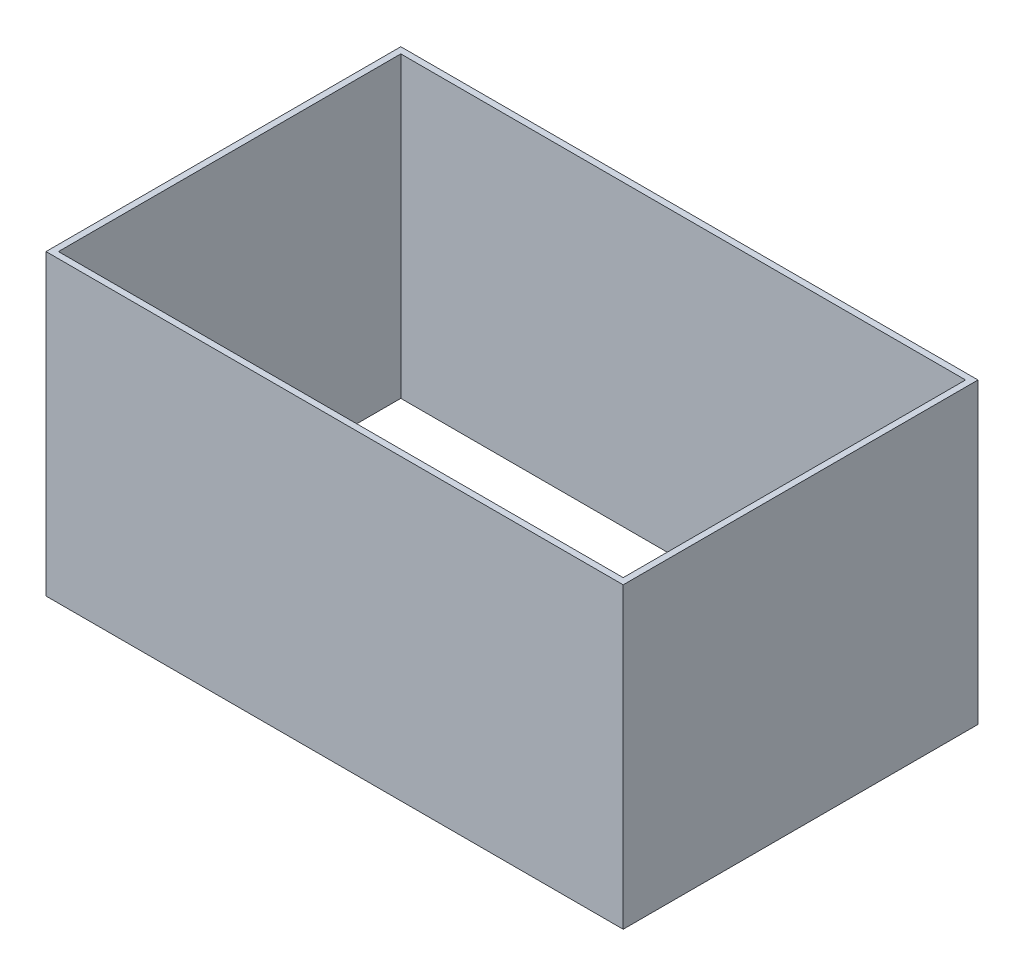
ISO-10303-21;
HEADER;
FILE_DESCRIPTION(('STEP AP214'),'2;1');
FILE_NAME('part.step','',(''),(''),'','','');
FILE_SCHEMA(('AUTOMOTIVE_DESIGN { 1 0 10303 214 1 1 1 1 }'));
ENDSEC;
DATA;
#1=APPLICATION_CONTEXT('core data for automotive mechanical design processes');
#2=APPLICATION_PROTOCOL_DEFINITION('international standard','automotive_design',2000,#1);
#3=PRODUCT_CONTEXT('',#1,'mechanical');
#4=PRODUCT('Part','Part','',(#3));
#5=PRODUCT_RELATED_PRODUCT_CATEGORY('part','',(#4));
#6=PRODUCT_DEFINITION_FORMATION('','',#4);
#7=PRODUCT_DEFINITION_CONTEXT('part definition',#1,'design');
#8=PRODUCT_DEFINITION('design','',#6,#7);
#9=PRODUCT_DEFINITION_SHAPE('','',#8);
#10=(LENGTH_UNIT() NAMED_UNIT(*) SI_UNIT(.MILLI.,.METRE.));
#11=(NAMED_UNIT(*) PLANE_ANGLE_UNIT() SI_UNIT($,.RADIAN.));
#12=(NAMED_UNIT(*) SI_UNIT($,.STERADIAN.) SOLID_ANGLE_UNIT());
#13=UNCERTAINTY_MEASURE_WITH_UNIT(LENGTH_MEASURE(1.E-05),#10,'distance_accuracy_value','');
#14=(GEOMETRIC_REPRESENTATION_CONTEXT(3) GLOBAL_UNCERTAINTY_ASSIGNED_CONTEXT((#13)) GLOBAL_UNIT_ASSIGNED_CONTEXT((#10,
#11,#12)) REPRESENTATION_CONTEXT('',''));
#15=CARTESIAN_POINT('',(0.,0.,0.));
#16=DIRECTION('',(0.,0.,1.));
#17=DIRECTION('',(1.,0.,0.));
#18=AXIS2_PLACEMENT_3D('',#15,#16,#17);
#19=CARTESIAN_POINT('',(0.,121.92,0.));
#20=DIRECTION('',(0.,1.,0.));
#21=DIRECTION('',(0.,0.,1.));
#22=AXIS2_PLACEMENT_3D('',#19,#20,#21);
#23=PLANE('',#22);
#24=DIRECTION('',(0.,0.,1.));
#25=VECTOR('',#24,1.);
#26=CARTESIAN_POINT('',(-117.943051820049,121.92,69.9586202337691));
#27=LINE('',#26,#25);
#28=CARTESIAN_POINT('',(-117.943051820049,121.92,-72.4986202337691));
#29=VERTEX_POINT('',#28);
#30=CARTESIAN_POINT('',(-117.943051820049,121.92,72.4986202337691));
#31=VERTEX_POINT('',#30);
#32=EDGE_CURVE('E183',#29,#31,#27,.T.);
#33=ORIENTED_EDGE('',*,*,#32,.T.);
#34=DIRECTION('',(1.,0.,0.));
#35=VECTOR('',#34,1.);
#36=CARTESIAN_POINT('',(115.403051820049,121.92,72.4986202337691));
#37=LINE('',#36,#35);
#38=CARTESIAN_POINT('',(117.943051820049,121.92,72.4986202337691));
#39=VERTEX_POINT('',#38);
#40=EDGE_CURVE('E187',#31,#39,#37,.T.);
#41=ORIENTED_EDGE('',*,*,#40,.T.);
#42=DIRECTION('',(0.,0.,-1.));
#43=VECTOR('',#42,1.);
#44=CARTESIAN_POINT('',(117.943051820049,121.92,69.9586202337691));
#45=LINE('',#44,#43);
#46=CARTESIAN_POINT('',(117.943051820049,121.92,-72.4986202337691));
#47=VERTEX_POINT('',#46);
#48=EDGE_CURVE('E191',#39,#47,#45,.T.);
#49=ORIENTED_EDGE('',*,*,#48,.T.);
#50=DIRECTION('',(-1.,0.,0.));
#51=VECTOR('',#50,1.);
#52=CARTESIAN_POINT('',(115.403051820049,121.92,-72.4986202337691));
#53=LINE('',#52,#51);
#54=EDGE_CURVE('E194',#47,#29,#53,.T.);
#55=ORIENTED_EDGE('',*,*,#54,.T.);
#56=EDGE_LOOP('',(#33,#41,#49,#55));
#57=FACE_BOUND('',#56,.T.);
#58=DIRECTION('',(1.,0.,0.));
#59=VECTOR('',#58,1.);
#60=CARTESIAN_POINT('',(115.403051820049,121.92,69.9586202337691));
#61=LINE('',#60,#59);
#62=CARTESIAN_POINT('',(-115.403051820049,121.92,69.9586202337691));
#63=VERTEX_POINT('',#62);
#64=CARTESIAN_POINT('',(115.403051820049,121.92,69.9586202337691));
#65=VERTEX_POINT('',#64);
#66=EDGE_CURVE('E144',#63,#65,#61,.T.);
#67=ORIENTED_EDGE('',*,*,#66,.F.);
#68=DIRECTION('',(0.,0.,1.));
#69=VECTOR('',#68,1.);
#70=CARTESIAN_POINT('',(-115.403051820049,121.92,69.9586202337691));
#71=LINE('',#70,#69);
#72=CARTESIAN_POINT('',(-115.403051820049,121.92,-69.9586202337691));
#73=VERTEX_POINT('',#72);
#74=EDGE_CURVE('E135',#73,#63,#71,.T.);
#75=ORIENTED_EDGE('',*,*,#74,.F.);
#76=DIRECTION('',(-1.,0.,0.));
#77=VECTOR('',#76,1.);
#78=CARTESIAN_POINT('',(115.403051820049,121.92,-69.9586202337691));
#79=LINE('',#78,#77);
#80=CARTESIAN_POINT('',(115.403051820049,121.92,-69.9586202337691));
#81=VERTEX_POINT('',#80);
#82=EDGE_CURVE('E161',#81,#73,#79,.T.);
#83=ORIENTED_EDGE('',*,*,#82,.F.);
#84=DIRECTION('',(0.,0.,-1.));
#85=VECTOR('',#84,1.);
#86=CARTESIAN_POINT('',(115.403051820049,121.92,69.9586202337691));
#87=LINE('',#86,#85);
#88=EDGE_CURVE('E157',#65,#81,#87,.T.);
#89=ORIENTED_EDGE('',*,*,#88,.F.);
#90=EDGE_LOOP('',(#67,#75,#83,#89));
#91=FACE_BOUND('',#90,.T.);
#92=ADVANCED_FACE('F69',(#57,#91),#23,.T.);
#93=CARTESIAN_POINT('',(0.,0.,0.));
#94=DIRECTION('',(0.,1.,0.));
#95=DIRECTION('',(0.,0.,1.));
#96=AXIS2_PLACEMENT_3D('',#93,#94,#95);
#97=PLANE('',#96);
#98=DIRECTION('',(0.,0.,1.));
#99=VECTOR('',#98,1.);
#100=CARTESIAN_POINT('',(-117.943051820049,0.,69.9586202337691));
#101=LINE('',#100,#99);
#102=CARTESIAN_POINT('',(-117.943051820049,0.,-72.4986202337691));
#103=VERTEX_POINT('',#102);
#104=CARTESIAN_POINT('',(-117.943051820049,0.,72.4986202337691));
#105=VERTEX_POINT('',#104);
#106=EDGE_CURVE('E153',#103,#105,#101,.T.);
#107=ORIENTED_EDGE('',*,*,#106,.F.);
#108=DIRECTION('',(-1.,0.,0.));
#109=VECTOR('',#108,1.);
#110=CARTESIAN_POINT('',(115.403051820049,0.,-72.4986202337691));
#111=LINE('',#110,#109);
#112=CARTESIAN_POINT('',(117.943051820049,0.,-72.4986202337691));
#113=VERTEX_POINT('',#112);
#114=EDGE_CURVE('E188',#113,#103,#111,.T.);
#115=ORIENTED_EDGE('',*,*,#114,.F.);
#116=DIRECTION('',(0.,0.,-1.));
#117=VECTOR('',#116,1.);
#118=CARTESIAN_POINT('',(117.943051820049,0.,69.9586202337691));
#119=LINE('',#118,#117);
#120=CARTESIAN_POINT('',(117.943051820049,0.,72.4986202337691));
#121=VERTEX_POINT('',#120);
#122=EDGE_CURVE('E204',#121,#113,#119,.T.);
#123=ORIENTED_EDGE('',*,*,#122,.F.);
#124=DIRECTION('',(1.,0.,0.));
#125=VECTOR('',#124,1.);
#126=CARTESIAN_POINT('',(115.403051820049,0.,72.4986202337691));
#127=LINE('',#126,#125);
#128=EDGE_CURVE('E201',#105,#121,#127,.T.);
#129=ORIENTED_EDGE('',*,*,#128,.F.);
#130=EDGE_LOOP('',(#107,#115,#123,#129));
#131=FACE_BOUND('',#130,.T.);
#132=DIRECTION('',(0.,0.,1.));
#133=VECTOR('',#132,1.);
#134=CARTESIAN_POINT('',(-115.403051820049,0.,69.9586202337691));
#135=LINE('',#134,#133);
#136=CARTESIAN_POINT('',(-115.403051820049,0.,-69.9586202337691));
#137=VERTEX_POINT('',#136);
#138=CARTESIAN_POINT('',(-115.403051820049,0.,69.9586202337691));
#139=VERTEX_POINT('',#138);
#140=EDGE_CURVE('E93',#137,#139,#135,.T.);
#141=ORIENTED_EDGE('',*,*,#140,.T.);
#142=DIRECTION('',(1.,0.,0.));
#143=VECTOR('',#142,1.);
#144=CARTESIAN_POINT('',(115.403051820049,0.,69.9586202337691));
#145=LINE('',#144,#143);
#146=CARTESIAN_POINT('',(115.403051820049,0.,69.9586202337691));
#147=VERTEX_POINT('',#146);
#148=EDGE_CURVE('E151',#139,#147,#145,.T.);
#149=ORIENTED_EDGE('',*,*,#148,.T.);
#150=DIRECTION('',(0.,0.,-1.));
#151=VECTOR('',#150,1.);
#152=CARTESIAN_POINT('',(115.403051820049,0.,69.9586202337691));
#153=LINE('',#152,#151);
#154=CARTESIAN_POINT('',(115.403051820049,0.,-69.9586202337691));
#155=VERTEX_POINT('',#154);
#156=EDGE_CURVE('E170',#147,#155,#153,.T.);
#157=ORIENTED_EDGE('',*,*,#156,.T.);
#158=DIRECTION('',(-1.,0.,0.));
#159=VECTOR('',#158,1.);
#160=CARTESIAN_POINT('',(115.403051820049,0.,-69.9586202337691));
#161=LINE('',#160,#159);
#162=EDGE_CURVE('E145',#155,#137,#161,.T.);
#163=ORIENTED_EDGE('',*,*,#162,.T.);
#164=EDGE_LOOP('',(#141,#149,#157,#163));
#165=FACE_BOUND('',#164,.T.);
#166=ADVANCED_FACE('F227',(#131,#165),#97,.F.);
#167=CARTESIAN_POINT('',(-117.943051820049,121.92,69.9586202337691));
#168=DIRECTION('',(1.,0.,0.));
#169=DIRECTION('',(0.,0.,-1.));
#170=AXIS2_PLACEMENT_3D('',#167,#168,#169);
#171=PLANE('',#170);
#172=ORIENTED_EDGE('',*,*,#106,.T.);
#173=DIRECTION('',(0.,-1.,0.));
#174=VECTOR('',#173,1.);
#175=CARTESIAN_POINT('',(-117.943051820049,121.92,72.4986202337691));
#176=LINE('',#175,#174);
#177=EDGE_CURVE('E12',#31,#105,#176,.T.);
#178=ORIENTED_EDGE('',*,*,#177,.F.);
#179=ORIENTED_EDGE('',*,*,#32,.F.);
#180=DIRECTION('',(0.,-1.,0.));
#181=VECTOR('',#180,1.);
#182=CARTESIAN_POINT('',(-117.943051820049,121.92,-72.4986202337691));
#183=LINE('',#182,#181);
#184=EDGE_CURVE('E197',#29,#103,#183,.T.);
#185=ORIENTED_EDGE('',*,*,#184,.T.);
#186=EDGE_LOOP('',(#172,#178,#179,#185));
#187=FACE_BOUND('',#186,.T.);
#188=ADVANCED_FACE('F71',(#187),#171,.F.);
#189=CARTESIAN_POINT('',(115.403051820049,121.92,72.4986202337691));
#190=DIRECTION('',(0.,0.,-1.));
#191=DIRECTION('',(-1.,0.,0.));
#192=AXIS2_PLACEMENT_3D('',#189,#190,#191);
#193=PLANE('',#192);
#194=ORIENTED_EDGE('',*,*,#128,.T.);
#195=DIRECTION('',(0.,-1.,0.));
#196=VECTOR('',#195,1.);
#197=CARTESIAN_POINT('',(117.943051820049,121.92,72.4986202337691));
#198=LINE('',#197,#196);
#199=EDGE_CURVE('E78',#39,#121,#198,.T.);
#200=ORIENTED_EDGE('',*,*,#199,.F.);
#201=ORIENTED_EDGE('',*,*,#40,.F.);
#202=ORIENTED_EDGE('',*,*,#177,.T.);
#203=EDGE_LOOP('',(#194,#200,#201,#202));
#204=FACE_BOUND('',#203,.T.);
#205=ADVANCED_FACE('F237',(#204),#193,.F.);
#206=CARTESIAN_POINT('',(117.943051820049,121.92,69.9586202337691));
#207=DIRECTION('',(-1.,0.,0.));
#208=DIRECTION('',(0.,0.,1.));
#209=AXIS2_PLACEMENT_3D('',#206,#207,#208);
#210=PLANE('',#209);
#211=ORIENTED_EDGE('',*,*,#122,.T.);
#212=DIRECTION('',(0.,-1.,0.));
#213=VECTOR('',#212,1.);
#214=CARTESIAN_POINT('',(117.943051820049,121.92,-72.4986202337691));
#215=LINE('',#214,#213);
#216=EDGE_CURVE('E212',#47,#113,#215,.T.);
#217=ORIENTED_EDGE('',*,*,#216,.F.);
#218=ORIENTED_EDGE('',*,*,#48,.F.);
#219=ORIENTED_EDGE('',*,*,#199,.T.);
#220=EDGE_LOOP('',(#211,#217,#218,#219));
#221=FACE_BOUND('',#220,.T.);
#222=ADVANCED_FACE('F221',(#221),#210,.F.);
#223=CARTESIAN_POINT('',(115.403051820049,121.92,-72.4986202337691));
#224=DIRECTION('',(0.,0.,1.));
#225=DIRECTION('',(1.,0.,0.));
#226=AXIS2_PLACEMENT_3D('',#223,#224,#225);
#227=PLANE('',#226);
#228=ORIENTED_EDGE('',*,*,#114,.T.);
#229=ORIENTED_EDGE('',*,*,#184,.F.);
#230=ORIENTED_EDGE('',*,*,#54,.F.);
#231=ORIENTED_EDGE('',*,*,#216,.T.);
#232=EDGE_LOOP('',(#228,#229,#230,#231));
#233=FACE_BOUND('',#232,.T.);
#234=ADVANCED_FACE('F231',(#233),#227,.F.);
#235=CARTESIAN_POINT('',(-115.403051820049,121.92,69.9586202337691));
#236=DIRECTION('',(1.,0.,0.));
#237=DIRECTION('',(0.,0.,-1.));
#238=AXIS2_PLACEMENT_3D('',#235,#236,#237);
#239=PLANE('',#238);
#240=ORIENTED_EDGE('',*,*,#140,.F.);
#241=DIRECTION('',(0.,-1.,0.));
#242=VECTOR('',#241,1.);
#243=CARTESIAN_POINT('',(-115.403051820049,121.92,-69.9586202337691));
#244=LINE('',#243,#242);
#245=EDGE_CURVE('E139',#73,#137,#244,.T.);
#246=ORIENTED_EDGE('',*,*,#245,.F.);
#247=ORIENTED_EDGE('',*,*,#74,.T.);
#248=DIRECTION('',(0.,-1.,0.));
#249=VECTOR('',#248,1.);
#250=CARTESIAN_POINT('',(-115.403051820049,121.92,69.9586202337691));
#251=LINE('',#250,#249);
#252=EDGE_CURVE('E138',#63,#139,#251,.T.);
#253=ORIENTED_EDGE('',*,*,#252,.T.);
#254=EDGE_LOOP('',(#240,#246,#247,#253));
#255=FACE_BOUND('',#254,.T.);
#256=ADVANCED_FACE('F137',(#255),#239,.T.);
#257=CARTESIAN_POINT('',(115.403051820049,121.92,69.9586202337691));
#258=DIRECTION('',(0.,0.,-1.));
#259=DIRECTION('',(-1.,0.,0.));
#260=AXIS2_PLACEMENT_3D('',#257,#258,#259);
#261=PLANE('',#260);
#262=ORIENTED_EDGE('',*,*,#148,.F.);
#263=ORIENTED_EDGE('',*,*,#252,.F.);
#264=ORIENTED_EDGE('',*,*,#66,.T.);
#265=DIRECTION('',(0.,-1.,0.));
#266=VECTOR('',#265,1.);
#267=CARTESIAN_POINT('',(115.403051820049,121.92,69.9586202337691));
#268=LINE('',#267,#266);
#269=EDGE_CURVE('E154',#65,#147,#268,.T.);
#270=ORIENTED_EDGE('',*,*,#269,.T.);
#271=EDGE_LOOP('',(#262,#263,#264,#270));
#272=FACE_BOUND('',#271,.T.);
#273=ADVANCED_FACE('F148',(#272),#261,.T.);
#274=CARTESIAN_POINT('',(115.403051820049,121.92,69.9586202337691));
#275=DIRECTION('',(-1.,0.,0.));
#276=DIRECTION('',(0.,0.,1.));
#277=AXIS2_PLACEMENT_3D('',#274,#275,#276);
#278=PLANE('',#277);
#279=ORIENTED_EDGE('',*,*,#156,.F.);
#280=ORIENTED_EDGE('',*,*,#269,.F.);
#281=ORIENTED_EDGE('',*,*,#88,.T.);
#282=DIRECTION('',(0.,-1.,0.));
#283=VECTOR('',#282,1.);
#284=CARTESIAN_POINT('',(115.403051820049,121.92,-69.9586202337691));
#285=LINE('',#284,#283);
#286=EDGE_CURVE('E85',#81,#155,#285,.T.);
#287=ORIENTED_EDGE('',*,*,#286,.T.);
#288=EDGE_LOOP('',(#279,#280,#281,#287));
#289=FACE_BOUND('',#288,.T.);
#290=ADVANCED_FACE('F260',(#289),#278,.T.);
#291=CARTESIAN_POINT('',(115.403051820049,121.92,-69.9586202337691));
#292=DIRECTION('',(0.,0.,1.));
#293=DIRECTION('',(1.,0.,0.));
#294=AXIS2_PLACEMENT_3D('',#291,#292,#293);
#295=PLANE('',#294);
#296=ORIENTED_EDGE('',*,*,#162,.F.);
#297=ORIENTED_EDGE('',*,*,#286,.F.);
#298=ORIENTED_EDGE('',*,*,#82,.T.);
#299=ORIENTED_EDGE('',*,*,#245,.T.);
#300=EDGE_LOOP('',(#296,#297,#298,#299));
#301=FACE_BOUND('',#300,.T.);
#302=ADVANCED_FACE('F264',(#301),#295,.T.);
#303=CLOSED_SHELL('',(#92,#166,#188,#205,#222,#234,#256,#273,#290,#302));
#304=MANIFOLD_SOLID_BREP('B2',#303);
#305=ADVANCED_BREP_SHAPE_REPRESENTATION('',(#18,#304),#14);
#306=SHAPE_DEFINITION_REPRESENTATION(#9,#305);
ENDSEC;
END-ISO-10303-21;
